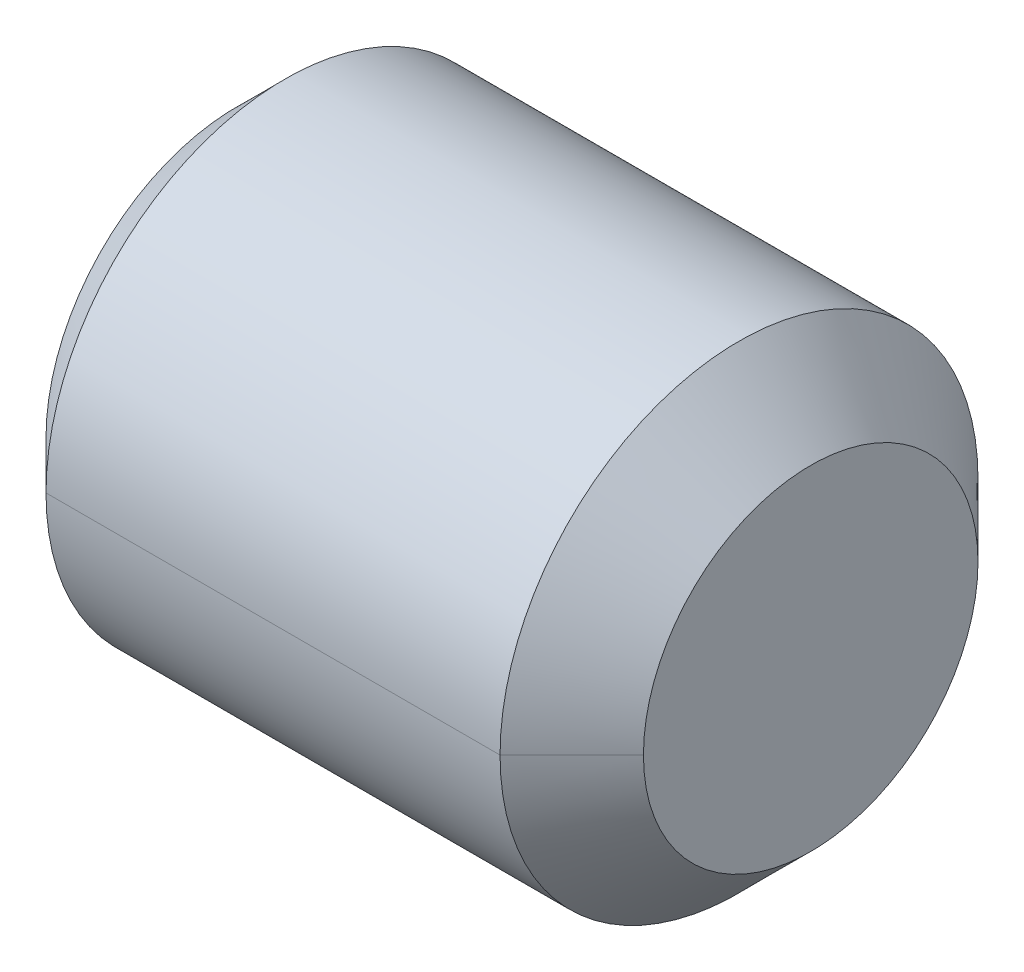
ISO-10303-21;
HEADER;
FILE_DESCRIPTION(('STEP AP214'),'2;1');
FILE_NAME('part.step','',(''),(''),'','','');
FILE_SCHEMA(('AUTOMOTIVE_DESIGN { 1 0 10303 214 1 1 1 1 }'));
ENDSEC;
DATA;
#1=APPLICATION_CONTEXT('core data for automotive mechanical design processes');
#2=APPLICATION_PROTOCOL_DEFINITION('international standard','automotive_design',2000,#1);
#3=PRODUCT_CONTEXT('',#1,'mechanical');
#4=PRODUCT('Part','Part','',(#3));
#5=PRODUCT_RELATED_PRODUCT_CATEGORY('part','',(#4));
#6=PRODUCT_DEFINITION_FORMATION('','',#4);
#7=PRODUCT_DEFINITION_CONTEXT('part definition',#1,'design');
#8=PRODUCT_DEFINITION('design','',#6,#7);
#9=PRODUCT_DEFINITION_SHAPE('','',#8);
#10=(LENGTH_UNIT() NAMED_UNIT(*) SI_UNIT(.MILLI.,.METRE.));
#11=(NAMED_UNIT(*) PLANE_ANGLE_UNIT() SI_UNIT($,.RADIAN.));
#12=(NAMED_UNIT(*) SI_UNIT($,.STERADIAN.) SOLID_ANGLE_UNIT());
#13=UNCERTAINTY_MEASURE_WITH_UNIT(LENGTH_MEASURE(1.E-05),#10,'distance_accuracy_value','');
#14=(GEOMETRIC_REPRESENTATION_CONTEXT(3) GLOBAL_UNCERTAINTY_ASSIGNED_CONTEXT((#13)) GLOBAL_UNIT_ASSIGNED_CONTEXT((#10,
#11,#12)) REPRESENTATION_CONTEXT('',''));
#15=CARTESIAN_POINT('',(0.,0.,0.));
#16=DIRECTION('',(0.,0.,1.));
#17=DIRECTION('',(1.,0.,0.));
#18=AXIS2_PLACEMENT_3D('',#15,#16,#17);
#19=CARTESIAN_POINT('',(-3.01724137931035,-1.04520307353294,0.603448275862068));
#20=DIRECTION('',(0.928476690885259,0.321633760451339,-0.185695338177051));
#21=DIRECTION('',(0.,-0.5,-0.866025403784439));
#22=AXIS2_PLACEMENT_3D('',#19,#20,#21);
#23=PLANE('',#22);
#24=DIRECTION('',(0.327326835353988,-0.944911182523068,0.));
#25=VECTOR('',#24,1.);
#26=CARTESIAN_POINT('',(-4.,1.44337567297406,0.));
#27=LINE('',#26,#25);
#28=CARTESIAN_POINT('',(-4.,1.44337567297406,0.));
#29=VERTEX_POINT('',#28);
#30=CARTESIAN_POINT('',(-3.5,0.,0.));
#31=VERTEX_POINT('',#30);
#32=EDGE_CURVE('E196',#29,#31,#27,.T.);
#33=ORIENTED_EDGE('',*,*,#32,.F.);
#34=CARTESIAN_POINT('',(-4.,1.44337567297406,0.));
#35=CARTESIAN_POINT('',(-4.,1.20281306081172,-0.416666666666667));
#36=CARTESIAN_POINT('',(-4.,0.962250448649378,-0.833333333333334));
#37=CARTESIAN_POINT('',(-4.,0.721687836487033,-1.25));
#38=(BOUNDED_CURVE() B_SPLINE_CURVE(3,(#34,#35,#36,#37),.UNSPECIFIED.,.F.,
.F.) B_SPLINE_CURVE_WITH_KNOTS((4,4),(0.,1.),
.UNSPECIFIED.) CURVE() GEOMETRIC_REPRESENTATION_ITEM() RATIONAL_B_SPLINE_CURVE((1.,1.,1.,1.)) REPRESENTATION_ITEM(''));
#39=CARTESIAN_POINT('',(-4.,0.721687836487033,-1.25));
#40=VERTEX_POINT('',#39);
#41=EDGE_CURVE('E69',#29,#40,#38,.T.);
#42=ORIENTED_EDGE('',*,*,#41,.T.);
#43=DIRECTION('',(0.327326835353988,-0.472455591261534,0.818317088384971));
#44=VECTOR('',#43,1.);
#45=CARTESIAN_POINT('',(-4.,0.721687836487033,-1.25));
#46=LINE('',#45,#44);
#47=EDGE_CURVE('E10',#40,#31,#46,.T.);
#48=ORIENTED_EDGE('',*,*,#47,.T.);
#49=EDGE_LOOP('',(#33,#42,#48));
#50=FACE_BOUND('',#49,.T.);
#51=ADVANCED_FACE('F16',(#50),#23,.F.);
#52=CARTESIAN_POINT('',(-3.01724137931035,0.,1.20689655172414));
#53=DIRECTION('',(0.928476690885259,0.,-0.371390676354103));
#54=DIRECTION('',(0.,-1.,0.));
#55=AXIS2_PLACEMENT_3D('',#52,#53,#54);
#56=PLANE('',#55);
#57=ORIENTED_EDGE('',*,*,#47,.F.);
#58=CARTESIAN_POINT('',(-4.,0.721687836487033,-1.25));
#59=CARTESIAN_POINT('',(-4.,0.240562612162345,-1.25));
#60=CARTESIAN_POINT('',(-4.,-0.240562612162344,-1.25));
#61=CARTESIAN_POINT('',(-4.,-0.721687836487033,-1.25));
#62=(BOUNDED_CURVE() B_SPLINE_CURVE(3,(#58,#59,#60,#61),.UNSPECIFIED.,.F.,
.F.) B_SPLINE_CURVE_WITH_KNOTS((4,4),(0.,1.),
.UNSPECIFIED.) CURVE() GEOMETRIC_REPRESENTATION_ITEM() RATIONAL_B_SPLINE_CURVE((1.,1.,1.,1.)) REPRESENTATION_ITEM(''));
#63=CARTESIAN_POINT('',(-4.,-0.721687836487033,-1.25));
#64=VERTEX_POINT('',#63);
#65=EDGE_CURVE('E118',#40,#64,#62,.T.);
#66=ORIENTED_EDGE('',*,*,#65,.T.);
#67=DIRECTION('',(0.327326835353988,0.472455591261534,0.818317088384972));
#68=VECTOR('',#67,1.);
#69=CARTESIAN_POINT('',(-4.,-0.721687836487033,-1.25));
#70=LINE('',#69,#68);
#71=EDGE_CURVE('E20',#64,#31,#70,.T.);
#72=ORIENTED_EDGE('',*,*,#71,.T.);
#73=EDGE_LOOP('',(#57,#66,#72));
#74=FACE_BOUND('',#73,.T.);
#75=ADVANCED_FACE('F480',(#74),#56,.F.);
#76=CARTESIAN_POINT('',(-3.01724137931035,1.04520307353294,0.603448275862069));
#77=DIRECTION('',(0.92847669088526,-0.321633760451339,-0.185695338177052));
#78=DIRECTION('',(0.,0.5,-0.866025403784439));
#79=AXIS2_PLACEMENT_3D('',#76,#77,#78);
#80=PLANE('',#79);
#81=ORIENTED_EDGE('',*,*,#71,.F.);
#82=CARTESIAN_POINT('',(-4.,-0.721687836487033,-1.25));
#83=CARTESIAN_POINT('',(-4.,-0.962250448649377,-0.833333333333334));
#84=CARTESIAN_POINT('',(-4.,-1.20281306081172,-0.416666666666667));
#85=CARTESIAN_POINT('',(-4.,-1.44337567297406,0.));
#86=(BOUNDED_CURVE() B_SPLINE_CURVE(3,(#82,#83,#84,#85),.UNSPECIFIED.,.F.,
.F.) B_SPLINE_CURVE_WITH_KNOTS((4,4),(0.,1.),
.UNSPECIFIED.) CURVE() GEOMETRIC_REPRESENTATION_ITEM() RATIONAL_B_SPLINE_CURVE((1.,1.,1.,1.)) REPRESENTATION_ITEM(''));
#87=CARTESIAN_POINT('',(-4.,-1.44337567297406,0.));
#88=VERTEX_POINT('',#87);
#89=EDGE_CURVE('E119',#64,#88,#86,.T.);
#90=ORIENTED_EDGE('',*,*,#89,.T.);
#91=DIRECTION('',(0.327326835353988,0.944911182523068,0.));
#92=VECTOR('',#91,1.);
#93=CARTESIAN_POINT('',(-4.,-1.44337567297406,0.));
#94=LINE('',#93,#92);
#95=EDGE_CURVE('E193',#88,#31,#94,.T.);
#96=ORIENTED_EDGE('',*,*,#95,.T.);
#97=EDGE_LOOP('',(#81,#90,#96));
#98=FACE_BOUND('',#97,.T.);
#99=ADVANCED_FACE('F485',(#98),#80,.F.);
#100=CARTESIAN_POINT('',(-3.01724137931035,1.04520307353294,-0.603448275862069));
#101=DIRECTION('',(0.928476690885259,-0.321633760451339,0.185695338177051));
#102=DIRECTION('',(0.,-0.5,-0.866025403784439));
#103=AXIS2_PLACEMENT_3D('',#100,#101,#102);
#104=PLANE('',#103);
#105=ORIENTED_EDGE('',*,*,#95,.F.);
#106=CARTESIAN_POINT('',(-4.,-1.44337567297406,0.));
#107=CARTESIAN_POINT('',(-4.,-1.20281306081172,0.416666666666666));
#108=CARTESIAN_POINT('',(-4.,-0.962250448649377,0.833333333333334));
#109=CARTESIAN_POINT('',(-4.,-0.721687836487033,1.25));
#110=(BOUNDED_CURVE() B_SPLINE_CURVE(3,(#106,#107,#108,#109),.UNSPECIFIED.,.F.,
.F.) B_SPLINE_CURVE_WITH_KNOTS((4,4),(0.,1.),
.UNSPECIFIED.) CURVE() GEOMETRIC_REPRESENTATION_ITEM() RATIONAL_B_SPLINE_CURVE((1.,1.,1.,1.)) REPRESENTATION_ITEM(''));
#111=CARTESIAN_POINT('',(-4.,-0.721687836487033,1.25));
#112=VERTEX_POINT('',#111);
#113=EDGE_CURVE('E138',#88,#112,#110,.T.);
#114=ORIENTED_EDGE('',*,*,#113,.T.);
#115=DIRECTION('',(0.327326835353988,0.472455591261535,-0.818317088384971));
#116=VECTOR('',#115,1.);
#117=CARTESIAN_POINT('',(-4.,-0.721687836487033,1.25));
#118=LINE('',#117,#116);
#119=EDGE_CURVE('E68',#112,#31,#118,.T.);
#120=ORIENTED_EDGE('',*,*,#119,.T.);
#121=EDGE_LOOP('',(#105,#114,#120));
#122=FACE_BOUND('',#121,.T.);
#123=ADVANCED_FACE('F247',(#122),#104,.F.);
#124=CARTESIAN_POINT('',(-3.01724137931035,-1.04520307353294,-0.603448275862069));
#125=DIRECTION('',(0.928476690885259,0.321633760451339,0.185695338177052));
#126=DIRECTION('',(0.,0.5,-0.866025403784439));
#127=AXIS2_PLACEMENT_3D('',#124,#125,#126);
#128=PLANE('',#127);
#129=DIRECTION('',(0.327326835353988,-0.472455591261534,-0.818317088384972));
#130=VECTOR('',#129,1.);
#131=CARTESIAN_POINT('',(-4.,0.721687836487033,1.25));
#132=LINE('',#131,#130);
#133=CARTESIAN_POINT('',(-4.,0.721687836487033,1.25));
#134=VERTEX_POINT('',#133);
#135=EDGE_CURVE('E226',#134,#31,#132,.T.);
#136=ORIENTED_EDGE('',*,*,#135,.F.);
#137=CARTESIAN_POINT('',(-4.,0.721687836487033,1.25));
#138=CARTESIAN_POINT('',(-4.,0.962250448649377,0.833333333333334));
#139=CARTESIAN_POINT('',(-4.,1.20281306081172,0.416666666666667));
#140=CARTESIAN_POINT('',(-4.,1.44337567297406,0.));
#141=(BOUNDED_CURVE() B_SPLINE_CURVE(3,(#137,#138,#139,#140),.UNSPECIFIED.,.F.,
.F.) B_SPLINE_CURVE_WITH_KNOTS((4,4),(0.,1.),
.UNSPECIFIED.) CURVE() GEOMETRIC_REPRESENTATION_ITEM() RATIONAL_B_SPLINE_CURVE((1.,1.,1.,1.)) REPRESENTATION_ITEM(''));
#142=EDGE_CURVE('E98',#134,#29,#141,.T.);
#143=ORIENTED_EDGE('',*,*,#142,.T.);
#144=ORIENTED_EDGE('',*,*,#32,.T.);
#145=EDGE_LOOP('',(#136,#143,#144));
#146=FACE_BOUND('',#145,.T.);
#147=ADVANCED_FACE('F272',(#146),#128,.F.);
#148=CARTESIAN_POINT('',(-3.01724137931035,0.,-1.20689655172414));
#149=DIRECTION('',(0.928476690885259,0.,0.371390676354103));
#150=DIRECTION('',(0.,-1.,0.));
#151=AXIS2_PLACEMENT_3D('',#148,#149,#150);
#152=PLANE('',#151);
#153=ORIENTED_EDGE('',*,*,#119,.F.);
#154=CARTESIAN_POINT('',(-4.,-0.721687836487033,1.25));
#155=CARTESIAN_POINT('',(-4.,-0.240562612162345,1.25));
#156=CARTESIAN_POINT('',(-4.,0.240562612162344,1.25));
#157=CARTESIAN_POINT('',(-4.,0.721687836487033,1.25));
#158=(BOUNDED_CURVE() B_SPLINE_CURVE(3,(#154,#155,#156,#157),.UNSPECIFIED.,.F.,
.F.) B_SPLINE_CURVE_WITH_KNOTS((4,4),(0.,1.),
.UNSPECIFIED.) CURVE() GEOMETRIC_REPRESENTATION_ITEM() RATIONAL_B_SPLINE_CURVE((1.,1.,1.,1.)) REPRESENTATION_ITEM(''));
#159=EDGE_CURVE('E144',#112,#134,#158,.T.);
#160=ORIENTED_EDGE('',*,*,#159,.T.);
#161=ORIENTED_EDGE('',*,*,#135,.T.);
#162=EDGE_LOOP('',(#153,#160,#161));
#163=FACE_BOUND('',#162,.T.);
#164=ADVANCED_FACE('F18',(#163),#152,.F.);
#165=CARTESIAN_POINT('',(0.,0.,0.));
#166=DIRECTION('',(1.,0.,0.));
#167=DIRECTION('',(0.,1.,0.));
#168=AXIS2_PLACEMENT_3D('',#165,#166,#167);
#169=PLANE('',#168);
#170=CARTESIAN_POINT('',(0.,0.,0.));
#171=DIRECTION('',(1.,0.,0.));
#172=DIRECTION('',(0.,0.,-1.));
#173=AXIS2_PLACEMENT_3D('',#170,#171,#172);
#174=CIRCLE('',#173,1.75);
#175=CARTESIAN_POINT('',(0.,0.,1.75));
#176=VERTEX_POINT('',#175);
#177=CARTESIAN_POINT('',(0.,0.,-1.75));
#178=VERTEX_POINT('',#177);
#179=EDGE_CURVE('E59',#176,#178,#174,.T.);
#180=ORIENTED_EDGE('',*,*,#179,.T.);
#181=CARTESIAN_POINT('',(0.,0.,0.));
#182=DIRECTION('',(1.,0.,0.));
#183=DIRECTION('',(0.,0.,-1.));
#184=AXIS2_PLACEMENT_3D('',#181,#182,#183);
#185=CIRCLE('',#184,1.75);
#186=EDGE_CURVE('E63',#178,#176,#185,.T.);
#187=ORIENTED_EDGE('',*,*,#186,.T.);
#188=EDGE_LOOP('',(#180,#187));
#189=FACE_BOUND('',#188,.T.);
#190=ADVANCED_FACE('F61',(#189),#169,.T.);
#191=CARTESIAN_POINT('',(-0.75,0.,0.));
#192=DIRECTION('',(-1.,0.,0.));
#193=DIRECTION('',(0.,0.,1.));
#194=AXIS2_PLACEMENT_3D('',#191,#192,#193);
#195=CONICAL_SURFACE('',#194,2.5,0.785398163397443);
#196=DIRECTION('',(-0.707106781186551,0.,-0.707106781186544));
#197=VECTOR('',#196,1.);
#198=CARTESIAN_POINT('',(-0.75,0.,-2.5));
#199=LINE('',#198,#197);
#200=CARTESIAN_POINT('',(-0.75,0.,-2.5));
#201=VERTEX_POINT('',#200);
#202=EDGE_CURVE('E73',#178,#201,#199,.T.);
#203=ORIENTED_EDGE('',*,*,#202,.F.);
#204=ORIENTED_EDGE('',*,*,#179,.F.);
#205=DIRECTION('',(-0.707106781186551,0.,0.707106781186544));
#206=VECTOR('',#205,1.);
#207=CARTESIAN_POINT('',(-0.75,0.,2.5));
#208=LINE('',#207,#206);
#209=CARTESIAN_POINT('',(-0.75,0.,2.5));
#210=VERTEX_POINT('',#209);
#211=EDGE_CURVE('E84',#176,#210,#208,.T.);
#212=ORIENTED_EDGE('',*,*,#211,.T.);
#213=CARTESIAN_POINT('',(-0.75,0.,0.));
#214=DIRECTION('',(1.,0.,0.));
#215=DIRECTION('',(0.,0.,-1.));
#216=AXIS2_PLACEMENT_3D('',#213,#214,#215);
#217=CIRCLE('',#216,2.5);
#218=EDGE_CURVE('E76',#210,#201,#217,.T.);
#219=ORIENTED_EDGE('',*,*,#218,.T.);
#220=EDGE_LOOP('',(#203,#204,#212,#219));
#221=FACE_BOUND('',#220,.T.);
#222=ADVANCED_FACE('F74',(#221),#195,.T.);
#223=CARTESIAN_POINT('',(-4.,1.44337567297406,0.));
#224=DIRECTION('',(0.,0.866025403784439,-0.5));
#225=DIRECTION('',(-1.,0.,0.));
#226=AXIS2_PLACEMENT_3D('',#223,#224,#225);
#227=PLANE('',#226);
#228=DIRECTION('',(0.,-0.5,-0.866025403784439));
#229=VECTOR('',#228,1.);
#230=CARTESIAN_POINT('',(-6.,1.44337567297406,0.));
#231=LINE('',#230,#229);
#232=CARTESIAN_POINT('',(-6.,1.44337567297406,0.));
#233=VERTEX_POINT('',#232);
#234=CARTESIAN_POINT('',(-6.,0.721687836487033,-1.25));
#235=VERTEX_POINT('',#234);
#236=EDGE_CURVE('E99',#233,#235,#231,.T.);
#237=ORIENTED_EDGE('',*,*,#236,.T.);
#238=DIRECTION('',(-1.,0.,0.));
#239=VECTOR('',#238,1.);
#240=CARTESIAN_POINT('',(-4.,0.721687836487033,-1.25));
#241=LINE('',#240,#239);
#242=EDGE_CURVE('E125',#40,#235,#241,.T.);
#243=ORIENTED_EDGE('',*,*,#242,.F.);
#244=ORIENTED_EDGE('',*,*,#41,.F.);
#245=DIRECTION('',(-1.,0.,0.));
#246=VECTOR('',#245,1.);
#247=CARTESIAN_POINT('',(-4.,1.44337567297406,0.));
#248=LINE('',#247,#246);
#249=EDGE_CURVE('E95',#29,#233,#248,.T.);
#250=ORIENTED_EDGE('',*,*,#249,.T.);
#251=EDGE_LOOP('',(#237,#243,#244,#250));
#252=FACE_BOUND('',#251,.T.);
#253=ADVANCED_FACE('F576',(#252),#227,.F.);
#254=CARTESIAN_POINT('',(-4.,0.721687836487033,-1.25));
#255=DIRECTION('',(0.,0.,-1.));
#256=DIRECTION('',(0.,-1.,0.));
#257=AXIS2_PLACEMENT_3D('',#254,#255,#256);
#258=PLANE('',#257);
#259=DIRECTION('',(0.,-1.,0.));
#260=VECTOR('',#259,1.);
#261=CARTESIAN_POINT('',(-6.,0.721687836487033,-1.25));
#262=LINE('',#261,#260);
#263=CARTESIAN_POINT('',(-6.,-0.721687836487032,-1.25));
#264=VERTEX_POINT('',#263);
#265=EDGE_CURVE('E103',#235,#264,#262,.T.);
#266=ORIENTED_EDGE('',*,*,#265,.T.);
#267=DIRECTION('',(-1.,0.,0.));
#268=VECTOR('',#267,1.);
#269=CARTESIAN_POINT('',(-4.,-0.721687836487032,-1.25));
#270=LINE('',#269,#268);
#271=EDGE_CURVE('E114',#64,#264,#270,.T.);
#272=ORIENTED_EDGE('',*,*,#271,.F.);
#273=ORIENTED_EDGE('',*,*,#65,.F.);
#274=ORIENTED_EDGE('',*,*,#242,.T.);
#275=EDGE_LOOP('',(#266,#272,#273,#274));
#276=FACE_BOUND('',#275,.T.);
#277=ADVANCED_FACE('F581',(#276),#258,.F.);
#278=CARTESIAN_POINT('',(-4.,-0.721687836487032,-1.25));
#279=DIRECTION('',(0.,-0.866025403784439,-0.5));
#280=DIRECTION('',(0.,0.5,-0.866025403784439));
#281=AXIS2_PLACEMENT_3D('',#278,#279,#280);
#282=PLANE('',#281);
#283=DIRECTION('',(0.,-0.5,0.866025403784439));
#284=VECTOR('',#283,1.);
#285=CARTESIAN_POINT('',(-6.,-0.721687836487032,-1.25));
#286=LINE('',#285,#284);
#287=CARTESIAN_POINT('',(-6.,-1.44337567297406,0.));
#288=VERTEX_POINT('',#287);
#289=EDGE_CURVE('E167',#264,#288,#286,.T.);
#290=ORIENTED_EDGE('',*,*,#289,.T.);
#291=DIRECTION('',(-1.,0.,0.));
#292=VECTOR('',#291,1.);
#293=CARTESIAN_POINT('',(-4.,-1.44337567297406,0.));
#294=LINE('',#293,#292);
#295=EDGE_CURVE('E134',#88,#288,#294,.T.);
#296=ORIENTED_EDGE('',*,*,#295,.F.);
#297=ORIENTED_EDGE('',*,*,#89,.F.);
#298=ORIENTED_EDGE('',*,*,#271,.T.);
#299=EDGE_LOOP('',(#290,#296,#297,#298));
#300=FACE_BOUND('',#299,.T.);
#301=ADVANCED_FACE('F529',(#300),#282,.F.);
#302=CARTESIAN_POINT('',(-4.,-1.44337567297406,0.));
#303=DIRECTION('',(0.,-0.866025403784439,0.5));
#304=DIRECTION('',(-1.,0.,0.));
#305=AXIS2_PLACEMENT_3D('',#302,#303,#304);
#306=PLANE('',#305);
#307=DIRECTION('',(0.,0.5,0.866025403784439));
#308=VECTOR('',#307,1.);
#309=CARTESIAN_POINT('',(-6.,-1.44337567297406,0.));
#310=LINE('',#309,#308);
#311=CARTESIAN_POINT('',(-6.,-0.721687836487033,1.25));
#312=VERTEX_POINT('',#311);
#313=EDGE_CURVE('E172',#288,#312,#310,.T.);
#314=ORIENTED_EDGE('',*,*,#313,.T.);
#315=DIRECTION('',(-1.,0.,0.));
#316=VECTOR('',#315,1.);
#317=CARTESIAN_POINT('',(-4.,-0.721687836487033,1.25));
#318=LINE('',#317,#316);
#319=EDGE_CURVE('E149',#112,#312,#318,.T.);
#320=ORIENTED_EDGE('',*,*,#319,.F.);
#321=ORIENTED_EDGE('',*,*,#113,.F.);
#322=ORIENTED_EDGE('',*,*,#295,.T.);
#323=EDGE_LOOP('',(#314,#320,#321,#322));
#324=FACE_BOUND('',#323,.T.);
#325=ADVANCED_FACE('F254',(#324),#306,.F.);
#326=CARTESIAN_POINT('',(-4.,-0.721687836487033,1.25));
#327=DIRECTION('',(0.,0.,1.));
#328=DIRECTION('',(1.,0.,0.));
#329=AXIS2_PLACEMENT_3D('',#326,#327,#328);
#330=PLANE('',#329);
#331=DIRECTION('',(0.,1.,0.));
#332=VECTOR('',#331,1.);
#333=CARTESIAN_POINT('',(-6.,-0.721687836487033,1.25));
#334=LINE('',#333,#332);
#335=CARTESIAN_POINT('',(-6.,0.721687836487033,1.25));
#336=VERTEX_POINT('',#335);
#337=EDGE_CURVE('E168',#312,#336,#334,.T.);
#338=ORIENTED_EDGE('',*,*,#337,.T.);
#339=DIRECTION('',(-1.,0.,0.));
#340=VECTOR('',#339,1.);
#341=CARTESIAN_POINT('',(-4.,0.721687836487033,1.25));
#342=LINE('',#341,#340);
#343=EDGE_CURVE('E150',#134,#336,#342,.T.);
#344=ORIENTED_EDGE('',*,*,#343,.F.);
#345=ORIENTED_EDGE('',*,*,#159,.F.);
#346=ORIENTED_EDGE('',*,*,#319,.T.);
#347=EDGE_LOOP('',(#338,#344,#345,#346));
#348=FACE_BOUND('',#347,.T.);
#349=ADVANCED_FACE('F261',(#348),#330,.F.);
#350=CARTESIAN_POINT('',(-4.,0.721687836487033,1.25));
#351=DIRECTION('',(0.,0.866025403784439,0.5));
#352=DIRECTION('',(1.,0.,0.));
#353=AXIS2_PLACEMENT_3D('',#350,#351,#352);
#354=PLANE('',#353);
#355=DIRECTION('',(0.,0.5,-0.866025403784439));
#356=VECTOR('',#355,1.);
#357=CARTESIAN_POINT('',(-6.,0.721687836487033,1.25));
#358=LINE('',#357,#356);
#359=EDGE_CURVE('E173',#336,#233,#358,.T.);
#360=ORIENTED_EDGE('',*,*,#359,.T.);
#361=ORIENTED_EDGE('',*,*,#249,.F.);
#362=ORIENTED_EDGE('',*,*,#142,.F.);
#363=ORIENTED_EDGE('',*,*,#343,.T.);
#364=EDGE_LOOP('',(#360,#361,#362,#363));
#365=FACE_BOUND('',#364,.T.);
#366=ADVANCED_FACE('F271',(#365),#354,.F.);
#367=CARTESIAN_POINT('',(-6.,2.,0.));
#368=DIRECTION('',(-1.,0.,0.));
#369=DIRECTION('',(0.,0.,1.));
#370=AXIS2_PLACEMENT_3D('',#367,#368,#369);
#371=PLANE('',#370);
#372=ORIENTED_EDGE('',*,*,#359,.F.);
#373=ORIENTED_EDGE('',*,*,#337,.F.);
#374=ORIENTED_EDGE('',*,*,#313,.F.);
#375=ORIENTED_EDGE('',*,*,#289,.F.);
#376=ORIENTED_EDGE('',*,*,#265,.F.);
#377=ORIENTED_EDGE('',*,*,#236,.F.);
#378=EDGE_LOOP('',(#372,#373,#374,#375,#376,#377));
#379=FACE_BOUND('',#378,.T.);
#380=CARTESIAN_POINT('',(-6.,0.,0.));
#381=DIRECTION('',(1.,0.,0.));
#382=DIRECTION('',(0.,0.,-1.));
#383=AXIS2_PLACEMENT_3D('',#380,#381,#382);
#384=CIRCLE('',#383,2.);
#385=CARTESIAN_POINT('',(-6.,0.,-2.));
#386=VERTEX_POINT('',#385);
#387=CARTESIAN_POINT('',(-6.,0.,2.));
#388=VERTEX_POINT('',#387);
#389=EDGE_CURVE('E106',#386,#388,#384,.T.);
#390=ORIENTED_EDGE('',*,*,#389,.F.);
#391=CARTESIAN_POINT('',(-6.,0.,0.));
#392=DIRECTION('',(1.,0.,0.));
#393=DIRECTION('',(0.,0.,-1.));
#394=AXIS2_PLACEMENT_3D('',#391,#392,#393);
#395=CIRCLE('',#394,2.);
#396=EDGE_CURVE('E184',#388,#386,#395,.T.);
#397=ORIENTED_EDGE('',*,*,#396,.F.);
#398=EDGE_LOOP('',(#390,#397));
#399=FACE_BOUND('',#398,.T.);
#400=ADVANCED_FACE('F334',(#379,#399),#371,.T.);
#401=CARTESIAN_POINT('',(-5.5,0.,0.));
#402=DIRECTION('',(1.,0.,0.));
#403=DIRECTION('',(0.,0.,-1.));
#404=AXIS2_PLACEMENT_3D('',#401,#402,#403);
#405=CONICAL_SURFACE('',#404,2.5,0.78539816339745);
#406=DIRECTION('',(0.707106781186546,0.,0.707106781186549));
#407=VECTOR('',#406,1.);
#408=CARTESIAN_POINT('',(-5.5,0.,2.5));
#409=LINE('',#408,#407);
#410=CARTESIAN_POINT('',(-5.5,0.,2.5));
#411=VERTEX_POINT('',#410);
#412=EDGE_CURVE('E110',#388,#411,#409,.T.);
#413=ORIENTED_EDGE('',*,*,#412,.F.);
#414=ORIENTED_EDGE('',*,*,#396,.T.);
#415=DIRECTION('',(0.707106781186546,0.,-0.707106781186549));
#416=VECTOR('',#415,1.);
#417=CARTESIAN_POINT('',(-5.5,0.,-2.5));
#418=LINE('',#417,#416);
#419=CARTESIAN_POINT('',(-5.5,0.,-2.5));
#420=VERTEX_POINT('',#419);
#421=EDGE_CURVE('E139',#386,#420,#418,.T.);
#422=ORIENTED_EDGE('',*,*,#421,.T.);
#423=CARTESIAN_POINT('',(-5.5,0.,0.));
#424=DIRECTION('',(1.,0.,0.));
#425=DIRECTION('',(0.,0.,-1.));
#426=AXIS2_PLACEMENT_3D('',#423,#424,#425);
#427=CIRCLE('',#426,2.5);
#428=EDGE_CURVE('E126',#411,#420,#427,.T.);
#429=ORIENTED_EDGE('',*,*,#428,.F.);
#430=EDGE_LOOP('',(#413,#414,#422,#429));
#431=FACE_BOUND('',#430,.T.);
#432=ADVANCED_FACE('F336',(#431),#405,.T.);
#433=CARTESIAN_POINT('',(0.,0.,0.));
#434=DIRECTION('',(1.,0.,0.));
#435=DIRECTION('',(0.,0.,-1.));
#436=AXIS2_PLACEMENT_3D('',#433,#434,#435);
#437=CYLINDRICAL_SURFACE('',#436,2.5);
#438=DIRECTION('',(1.,0.,0.));
#439=VECTOR('',#438,1.);
#440=CARTESIAN_POINT('',(0.,0.,2.5));
#441=LINE('',#440,#439);
#442=EDGE_CURVE('E143',#411,#210,#441,.T.);
#443=ORIENTED_EDGE('',*,*,#442,.F.);
#444=ORIENTED_EDGE('',*,*,#428,.T.);
#445=DIRECTION('',(1.,0.,0.));
#446=VECTOR('',#445,1.);
#447=CARTESIAN_POINT('',(0.,0.,-2.5));
#448=LINE('',#447,#446);
#449=EDGE_CURVE('E133',#420,#201,#448,.T.);
#450=ORIENTED_EDGE('',*,*,#449,.T.);
#451=ORIENTED_EDGE('',*,*,#218,.F.);
#452=EDGE_LOOP('',(#443,#444,#450,#451));
#453=FACE_BOUND('',#452,.T.);
#454=ADVANCED_FACE('F423',(#453),#437,.T.);
#455=CARTESIAN_POINT('',(0.,0.,0.));
#456=DIRECTION('',(1.,0.,0.));
#457=DIRECTION('',(0.,0.,-1.));
#458=AXIS2_PLACEMENT_3D('',#455,#456,#457);
#459=CYLINDRICAL_SURFACE('',#458,2.5);
#460=CARTESIAN_POINT('',(-5.5,0.,0.));
#461=DIRECTION('',(1.,0.,0.));
#462=DIRECTION('',(0.,0.,-1.));
#463=AXIS2_PLACEMENT_3D('',#460,#461,#462);
#464=CIRCLE('',#463,2.5);
#465=EDGE_CURVE('E93',#420,#411,#464,.T.);
#466=ORIENTED_EDGE('',*,*,#465,.T.);
#467=ORIENTED_EDGE('',*,*,#442,.T.);
#468=CARTESIAN_POINT('',(-0.75,0.,0.));
#469=DIRECTION('',(1.,0.,0.));
#470=DIRECTION('',(0.,0.,-1.));
#471=AXIS2_PLACEMENT_3D('',#468,#469,#470);
#472=CIRCLE('',#471,2.5);
#473=EDGE_CURVE('E81',#201,#210,#472,.T.);
#474=ORIENTED_EDGE('',*,*,#473,.F.);
#475=ORIENTED_EDGE('',*,*,#449,.F.);
#476=EDGE_LOOP('',(#466,#467,#474,#475));
#477=FACE_BOUND('',#476,.T.);
#478=ADVANCED_FACE('F429',(#477),#459,.T.);
#479=CARTESIAN_POINT('',(-5.5,0.,0.));
#480=DIRECTION('',(1.,0.,0.));
#481=DIRECTION('',(0.,0.,-1.));
#482=AXIS2_PLACEMENT_3D('',#479,#480,#481);
#483=CONICAL_SURFACE('',#482,2.5,0.78539816339745);
#484=ORIENTED_EDGE('',*,*,#389,.T.);
#485=ORIENTED_EDGE('',*,*,#412,.T.);
#486=ORIENTED_EDGE('',*,*,#465,.F.);
#487=ORIENTED_EDGE('',*,*,#421,.F.);
#488=EDGE_LOOP('',(#484,#485,#486,#487));
#489=FACE_BOUND('',#488,.T.);
#490=ADVANCED_FACE('F339',(#489),#483,.T.);
#491=CARTESIAN_POINT('',(-0.75,0.,0.));
#492=DIRECTION('',(-1.,0.,0.));
#493=DIRECTION('',(0.,0.,1.));
#494=AXIS2_PLACEMENT_3D('',#491,#492,#493);
#495=CONICAL_SURFACE('',#494,2.5,0.785398163397443);
#496=ORIENTED_EDGE('',*,*,#186,.F.);
#497=ORIENTED_EDGE('',*,*,#202,.T.);
#498=ORIENTED_EDGE('',*,*,#473,.T.);
#499=ORIENTED_EDGE('',*,*,#211,.F.);
#500=EDGE_LOOP('',(#496,#497,#498,#499));
#501=FACE_BOUND('',#500,.T.);
#502=ADVANCED_FACE('F83',(#501),#495,.T.);
#503=CLOSED_SHELL('',(#51,#75,#99,#123,#147,#164,#190,#222,#253,#277,#301,#325,#349,#366,#400,
#432,#454,#478,#490,#502));
#504=MANIFOLD_SOLID_BREP('B1',#503);
#505=ADVANCED_BREP_SHAPE_REPRESENTATION('',(#18,#504),#14);
#506=SHAPE_DEFINITION_REPRESENTATION(#9,#505);
ENDSEC;
END-ISO-10303-21;
